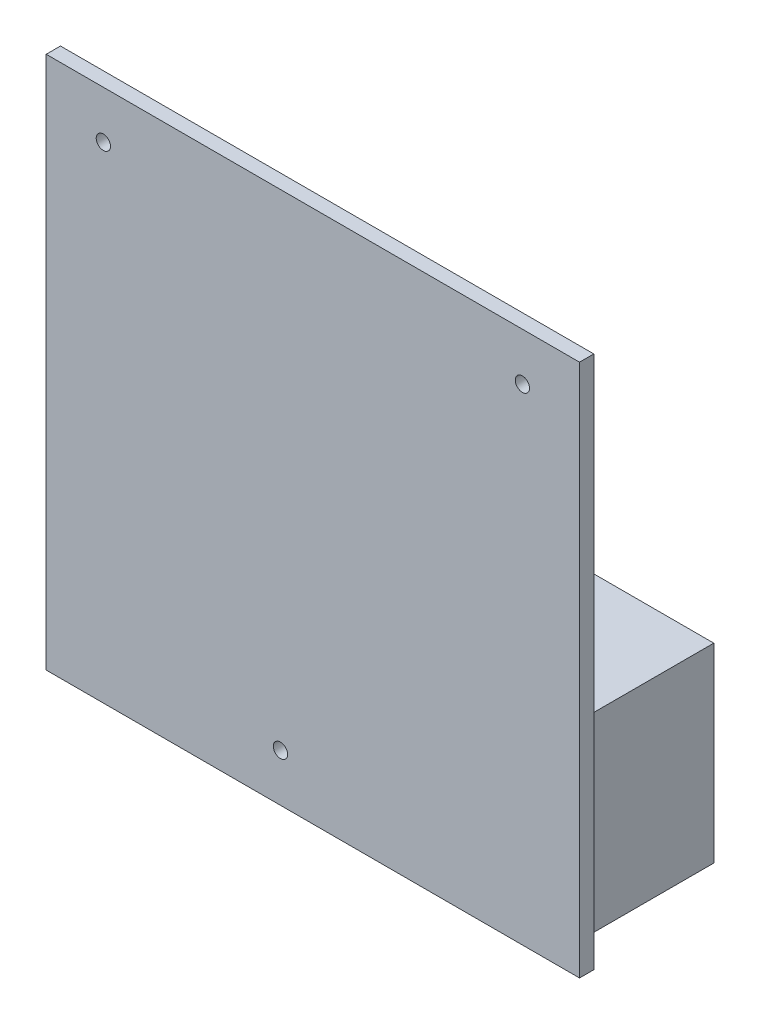
ISO-10303-21;
HEADER;
FILE_DESCRIPTION(('STEP AP214'),'2;1');
FILE_NAME('part.step','',(''),(''),'','','');
FILE_SCHEMA(('AUTOMOTIVE_DESIGN { 1 0 10303 214 1 1 1 1 }'));
ENDSEC;
DATA;
#1=APPLICATION_CONTEXT('core data for automotive mechanical design processes');
#2=APPLICATION_PROTOCOL_DEFINITION('international standard','automotive_design',2000,#1);
#3=PRODUCT_CONTEXT('',#1,'mechanical');
#4=PRODUCT('Part','Part','',(#3));
#5=PRODUCT_RELATED_PRODUCT_CATEGORY('part','',(#4));
#6=PRODUCT_DEFINITION_FORMATION('','',#4);
#7=PRODUCT_DEFINITION_CONTEXT('part definition',#1,'design');
#8=PRODUCT_DEFINITION('design','',#6,#7);
#9=PRODUCT_DEFINITION_SHAPE('','',#8);
#10=(LENGTH_UNIT() NAMED_UNIT(*) SI_UNIT(.MILLI.,.METRE.));
#11=(NAMED_UNIT(*) PLANE_ANGLE_UNIT() SI_UNIT($,.RADIAN.));
#12=(NAMED_UNIT(*) SI_UNIT($,.STERADIAN.) SOLID_ANGLE_UNIT());
#13=UNCERTAINTY_MEASURE_WITH_UNIT(LENGTH_MEASURE(1.E-05),#10,'distance_accuracy_value','');
#14=(GEOMETRIC_REPRESENTATION_CONTEXT(3) GLOBAL_UNCERTAINTY_ASSIGNED_CONTEXT((#13)) GLOBAL_UNIT_ASSIGNED_CONTEXT((#10,
#11,#12)) REPRESENTATION_CONTEXT('',''));
#15=CARTESIAN_POINT('',(0.,0.,0.));
#16=DIRECTION('',(0.,0.,1.));
#17=DIRECTION('',(1.,0.,0.));
#18=AXIS2_PLACEMENT_3D('',#15,#16,#17);
#19=CARTESIAN_POINT('',(-56.,-56.,3.));
#20=DIRECTION('',(0.,1.,0.));
#21=DIRECTION('',(0.,0.,1.));
#22=AXIS2_PLACEMENT_3D('',#19,#20,#21);
#23=PLANE('',#22);
#24=DIRECTION('',(1.,0.,0.));
#25=VECTOR('',#24,1.);
#26=CARTESIAN_POINT('',(-94.,-56.,0.));
#27=LINE('',#26,#25);
#28=CARTESIAN_POINT('',(-56.,-56.,0.));
#29=VERTEX_POINT('',#28);
#30=CARTESIAN_POINT('',(56.,-56.,0.));
#31=VERTEX_POINT('',#30);
#32=EDGE_CURVE('E155',#29,#31,#27,.T.);
#33=ORIENTED_EDGE('',*,*,#32,.F.);
#34=DIRECTION('',(0.,0.,-1.));
#35=VECTOR('',#34,1.);
#36=CARTESIAN_POINT('',(-56.,-56.,3.));
#37=LINE('',#36,#35);
#38=CARTESIAN_POINT('',(-56.,-56.,-3.));
#39=VERTEX_POINT('',#38);
#40=EDGE_CURVE('E173',#29,#39,#37,.T.);
#41=ORIENTED_EDGE('',*,*,#40,.T.);
#42=DIRECTION('',(1.,0.,0.));
#43=VECTOR('',#42,1.);
#44=CARTESIAN_POINT('',(-56.,-56.,-3.));
#45=LINE('',#44,#43);
#46=CARTESIAN_POINT('',(-0.802999999999998,-56.,-3.));
#47=VERTEX_POINT('',#46);
#48=EDGE_CURVE('E199',#39,#47,#45,.T.);
#49=ORIENTED_EDGE('',*,*,#48,.T.);
#50=DIRECTION('',(0.,0.,1.));
#51=VECTOR('',#50,1.);
#52=CARTESIAN_POINT('',(-0.802999999999998,-56.,-35.));
#53=LINE('',#52,#51);
#54=CARTESIAN_POINT('',(-0.802999999999998,-56.,-35.));
#55=VERTEX_POINT('',#54);
#56=EDGE_CURVE('E209',#55,#47,#53,.T.);
#57=ORIENTED_EDGE('',*,*,#56,.F.);
#58=DIRECTION('',(1.,0.,0.));
#59=VECTOR('',#58,1.);
#60=CARTESIAN_POINT('',(0.,-56.,-35.));
#61=LINE('',#60,#59);
#62=CARTESIAN_POINT('',(49.197,-56.,-35.));
#63=VERTEX_POINT('',#62);
#64=EDGE_CURVE('E211',#55,#63,#61,.T.);
#65=ORIENTED_EDGE('',*,*,#64,.T.);
#66=DIRECTION('',(0.,0.,1.));
#67=VECTOR('',#66,1.);
#68=CARTESIAN_POINT('',(49.197,-56.,-35.));
#69=LINE('',#68,#67);
#70=CARTESIAN_POINT('',(49.197,-56.,-3.));
#71=VERTEX_POINT('',#70);
#72=EDGE_CURVE('E207',#63,#71,#69,.T.);
#73=ORIENTED_EDGE('',*,*,#72,.T.);
#74=CARTESIAN_POINT('',(56.,-56.,-3.));
#75=VERTEX_POINT('',#74);
#76=EDGE_CURVE('E171',#71,#75,#45,.T.);
#77=ORIENTED_EDGE('',*,*,#76,.T.);
#78=DIRECTION('',(0.,0.,-1.));
#79=VECTOR('',#78,1.);
#80=CARTESIAN_POINT('',(56.,-56.,3.));
#81=LINE('',#80,#79);
#82=EDGE_CURVE('E167',#31,#75,#81,.T.);
#83=ORIENTED_EDGE('',*,*,#82,.F.);
#84=EDGE_LOOP('',(#33,#41,#49,#57,#65,#73,#77,#83));
#85=FACE_BOUND('',#84,.T.);
#86=ADVANCED_FACE('F38',(#85),#23,.F.);
#87=CARTESIAN_POINT('',(56.,-56.,3.));
#88=DIRECTION('',(-1.,0.,0.));
#89=DIRECTION('',(0.,0.,1.));
#90=AXIS2_PLACEMENT_3D('',#87,#88,#89);
#91=PLANE('',#90);
#92=DIRECTION('',(0.,-1.,0.));
#93=VECTOR('',#92,1.);
#94=CARTESIAN_POINT('',(56.,0.,0.));
#95=LINE('',#94,#93);
#96=CARTESIAN_POINT('',(56.,56.,0.));
#97=VERTEX_POINT('',#96);
#98=EDGE_CURVE('E158',#97,#31,#95,.T.);
#99=ORIENTED_EDGE('',*,*,#98,.T.);
#100=ORIENTED_EDGE('',*,*,#82,.T.);
#101=DIRECTION('',(0.,1.,0.));
#102=VECTOR('',#101,1.);
#103=CARTESIAN_POINT('',(56.,-56.,-3.));
#104=LINE('',#103,#102);
#105=CARTESIAN_POINT('',(56.,56.,-3.));
#106=VERTEX_POINT('',#105);
#107=EDGE_CURVE('E188',#75,#106,#104,.T.);
#108=ORIENTED_EDGE('',*,*,#107,.T.);
#109=DIRECTION('',(0.,0.,-1.));
#110=VECTOR('',#109,1.);
#111=CARTESIAN_POINT('',(56.,56.,3.));
#112=LINE('',#111,#110);
#113=EDGE_CURVE('E47',#97,#106,#112,.T.);
#114=ORIENTED_EDGE('',*,*,#113,.F.);
#115=EDGE_LOOP('',(#99,#100,#108,#114));
#116=FACE_BOUND('',#115,.T.);
#117=ADVANCED_FACE('F40',(#116),#91,.F.);
#118=CARTESIAN_POINT('',(-56.,56.,3.));
#119=DIRECTION('',(0.,-1.,0.));
#120=DIRECTION('',(0.,0.,-1.));
#121=AXIS2_PLACEMENT_3D('',#118,#119,#120);
#122=PLANE('',#121);
#123=DIRECTION('',(1.,0.,0.));
#124=VECTOR('',#123,1.);
#125=CARTESIAN_POINT('',(-94.,56.,0.));
#126=LINE('',#125,#124);
#127=CARTESIAN_POINT('',(-56.,56.,0.));
#128=VERTEX_POINT('',#127);
#129=EDGE_CURVE('E54',#128,#97,#126,.T.);
#130=ORIENTED_EDGE('',*,*,#129,.T.);
#131=ORIENTED_EDGE('',*,*,#113,.T.);
#132=DIRECTION('',(-1.,0.,0.));
#133=VECTOR('',#132,1.);
#134=CARTESIAN_POINT('',(-56.,56.,-3.));
#135=LINE('',#134,#133);
#136=CARTESIAN_POINT('',(-56.,56.,-3.));
#137=VERTEX_POINT('',#136);
#138=EDGE_CURVE('E174',#106,#137,#135,.T.);
#139=ORIENTED_EDGE('',*,*,#138,.T.);
#140=DIRECTION('',(0.,0.,-1.));
#141=VECTOR('',#140,1.);
#142=CARTESIAN_POINT('',(-56.,56.,3.));
#143=LINE('',#142,#141);
#144=EDGE_CURVE('E176',#128,#137,#143,.T.);
#145=ORIENTED_EDGE('',*,*,#144,.F.);
#146=EDGE_LOOP('',(#130,#131,#139,#145));
#147=FACE_BOUND('',#146,.T.);
#148=ADVANCED_FACE('F185',(#147),#122,.F.);
#149=CARTESIAN_POINT('',(-56.,-56.,3.));
#150=DIRECTION('',(1.,0.,0.));
#151=DIRECTION('',(0.,0.,-1.));
#152=AXIS2_PLACEMENT_3D('',#149,#150,#151);
#153=PLANE('',#152);
#154=DIRECTION('',(0.,-1.,0.));
#155=VECTOR('',#154,1.);
#156=CARTESIAN_POINT('',(-56.,-56.,0.));
#157=LINE('',#156,#155);
#158=EDGE_CURVE('E159',#128,#29,#157,.T.);
#159=ORIENTED_EDGE('',*,*,#158,.F.);
#160=ORIENTED_EDGE('',*,*,#144,.T.);
#161=DIRECTION('',(0.,-1.,0.));
#162=VECTOR('',#161,1.);
#163=CARTESIAN_POINT('',(-56.,-56.,-3.));
#164=LINE('',#163,#162);
#165=EDGE_CURVE('E179',#137,#39,#164,.T.);
#166=ORIENTED_EDGE('',*,*,#165,.T.);
#167=ORIENTED_EDGE('',*,*,#40,.F.);
#168=EDGE_LOOP('',(#159,#160,#166,#167));
#169=FACE_BOUND('',#168,.T.);
#170=ADVANCED_FACE('F339',(#169),#153,.F.);
#171=CARTESIAN_POINT('',(-6.803,-46.,-43.));
#172=DIRECTION('',(0.,0.,1.));
#173=DIRECTION('',(1.,0.,0.));
#174=AXIS2_PLACEMENT_3D('',#171,#172,#173);
#175=CYLINDRICAL_SURFACE('',#174,1.5);
#176=CARTESIAN_POINT('',(-6.803,-46.,-3.));
#177=DIRECTION('',(0.,0.,1.));
#178=DIRECTION('',(1.,0.,0.));
#179=AXIS2_PLACEMENT_3D('',#176,#177,#178);
#180=CIRCLE('',#179,1.5);
#181=CARTESIAN_POINT('',(-5.303,-46.,-3.));
#182=VERTEX_POINT('',#181);
#183=EDGE_CURVE('E295',#182,#182,#180,.T.);
#184=ORIENTED_EDGE('',*,*,#183,.F.);
#185=EDGE_LOOP('',(#184));
#186=FACE_BOUND('',#185,.T.);
#187=CARTESIAN_POINT('',(-6.803,-46.,0.));
#188=DIRECTION('',(0.,0.,1.));
#189=DIRECTION('',(1.,0.,0.));
#190=AXIS2_PLACEMENT_3D('',#187,#188,#189);
#191=CIRCLE('',#190,1.5);
#192=CARTESIAN_POINT('',(-5.303,-46.,0.));
#193=VERTEX_POINT('',#192);
#194=EDGE_CURVE('E304',#193,#193,#191,.F.);
#195=ORIENTED_EDGE('',*,*,#194,.F.);
#196=EDGE_LOOP('',(#195));
#197=FACE_BOUND('',#196,.T.);
#198=ADVANCED_FACE('F327',(#186,#197),#175,.F.);
#199=CARTESIAN_POINT('',(44.,46.,-43.));
#200=DIRECTION('',(0.,0.,1.));
#201=DIRECTION('',(1.,0.,0.));
#202=AXIS2_PLACEMENT_3D('',#199,#200,#201);
#203=CYLINDRICAL_SURFACE('',#202,1.5);
#204=CARTESIAN_POINT('',(44.,46.,-3.));
#205=DIRECTION('',(0.,0.,1.));
#206=DIRECTION('',(1.,0.,0.));
#207=AXIS2_PLACEMENT_3D('',#204,#205,#206);
#208=CIRCLE('',#207,1.5);
#209=CARTESIAN_POINT('',(45.5,46.,-3.));
#210=VERTEX_POINT('',#209);
#211=EDGE_CURVE('E298',#210,#210,#208,.T.);
#212=ORIENTED_EDGE('',*,*,#211,.F.);
#213=EDGE_LOOP('',(#212));
#214=FACE_BOUND('',#213,.T.);
#215=CARTESIAN_POINT('',(44.,46.,0.));
#216=DIRECTION('',(0.,0.,1.));
#217=DIRECTION('',(1.,0.,0.));
#218=AXIS2_PLACEMENT_3D('',#215,#216,#217);
#219=CIRCLE('',#218,1.5);
#220=CARTESIAN_POINT('',(45.5,46.,0.));
#221=VERTEX_POINT('',#220);
#222=EDGE_CURVE('E307',#221,#221,#219,.F.);
#223=ORIENTED_EDGE('',*,*,#222,.F.);
#224=EDGE_LOOP('',(#223));
#225=FACE_BOUND('',#224,.T.);
#226=ADVANCED_FACE('F317',(#214,#225),#203,.F.);
#227=CARTESIAN_POINT('',(-44.,46.,-43.));
#228=DIRECTION('',(0.,0.,1.));
#229=DIRECTION('',(1.,0.,0.));
#230=AXIS2_PLACEMENT_3D('',#227,#228,#229);
#231=CYLINDRICAL_SURFACE('',#230,1.5);
#232=CARTESIAN_POINT('',(-44.,46.,-3.));
#233=DIRECTION('',(0.,0.,1.));
#234=DIRECTION('',(1.,0.,0.));
#235=AXIS2_PLACEMENT_3D('',#232,#233,#234);
#236=CIRCLE('',#235,1.5);
#237=CARTESIAN_POINT('',(-42.5,46.,-3.));
#238=VERTEX_POINT('',#237);
#239=EDGE_CURVE('E294',#238,#238,#236,.T.);
#240=ORIENTED_EDGE('',*,*,#239,.F.);
#241=EDGE_LOOP('',(#240));
#242=FACE_BOUND('',#241,.T.);
#243=CARTESIAN_POINT('',(-44.,46.,0.));
#244=DIRECTION('',(0.,0.,1.));
#245=DIRECTION('',(1.,0.,0.));
#246=AXIS2_PLACEMENT_3D('',#243,#244,#245);
#247=CIRCLE('',#246,1.5);
#248=CARTESIAN_POINT('',(-42.5,46.,0.));
#249=VERTEX_POINT('',#248);
#250=EDGE_CURVE('E42',#249,#249,#247,.F.);
#251=ORIENTED_EDGE('',*,*,#250,.F.);
#252=EDGE_LOOP('',(#251));
#253=FACE_BOUND('',#252,.T.);
#254=ADVANCED_FACE('F314',(#242,#253),#231,.F.);
#255=CARTESIAN_POINT('',(-52.,-17.5,-21.));
#256=DIRECTION('',(1.,0.,0.));
#257=DIRECTION('',(0.,0.,-1.));
#258=AXIS2_PLACEMENT_3D('',#255,#256,#257);
#259=PLANE('',#258);
#260=DIRECTION('',(0.,-1.,0.));
#261=VECTOR('',#260,1.);
#262=CARTESIAN_POINT('',(-52.,28.5,-11.));
#263=LINE('',#262,#261);
#264=CARTESIAN_POINT('',(-52.,-15.,-11.));
#265=VERTEX_POINT('',#264);
#266=CARTESIAN_POINT('',(-52.,-17.5,-11.));
#267=VERTEX_POINT('',#266);
#268=EDGE_CURVE('E288',#265,#267,#263,.T.);
#269=ORIENTED_EDGE('',*,*,#268,.T.);
#270=DIRECTION('',(0.,0.,1.));
#271=VECTOR('',#270,1.);
#272=CARTESIAN_POINT('',(-52.,-17.5,-21.));
#273=LINE('',#272,#271);
#274=CARTESIAN_POINT('',(-52.,-17.5,-3.));
#275=VERTEX_POINT('',#274);
#276=EDGE_CURVE('E233',#267,#275,#273,.T.);
#277=ORIENTED_EDGE('',*,*,#276,.T.);
#278=DIRECTION('',(0.,1.,0.));
#279=VECTOR('',#278,1.);
#280=CARTESIAN_POINT('',(-52.,-17.5,-3.));
#281=LINE('',#280,#279);
#282=CARTESIAN_POINT('',(-52.,17.5,-3.));
#283=VERTEX_POINT('',#282);
#284=EDGE_CURVE('E247',#275,#283,#281,.T.);
#285=ORIENTED_EDGE('',*,*,#284,.T.);
#286=DIRECTION('',(0.,0.,1.));
#287=VECTOR('',#286,1.);
#288=CARTESIAN_POINT('',(-52.,17.5,-21.));
#289=LINE('',#288,#287);
#290=CARTESIAN_POINT('',(-52.,17.5,-11.));
#291=VERTEX_POINT('',#290);
#292=EDGE_CURVE('E231',#291,#283,#289,.T.);
#293=ORIENTED_EDGE('',*,*,#292,.F.);
#294=CARTESIAN_POINT('',(-52.,15.,-11.));
#295=VERTEX_POINT('',#294);
#296=EDGE_CURVE('E285',#291,#295,#263,.T.);
#297=ORIENTED_EDGE('',*,*,#296,.T.);
#298=DIRECTION('',(0.,0.,-1.));
#299=VECTOR('',#298,1.);
#300=CARTESIAN_POINT('',(-52.,15.,-5.));
#301=LINE('',#300,#299);
#302=CARTESIAN_POINT('',(-52.,15.,-5.));
#303=VERTEX_POINT('',#302);
#304=EDGE_CURVE('E259',#303,#295,#301,.T.);
#305=ORIENTED_EDGE('',*,*,#304,.F.);
#306=DIRECTION('',(0.,-1.,0.));
#307=VECTOR('',#306,1.);
#308=CARTESIAN_POINT('',(-52.,-15.,-5.));
#309=LINE('',#308,#307);
#310=CARTESIAN_POINT('',(-52.,-15.,-5.));
#311=VERTEX_POINT('',#310);
#312=EDGE_CURVE('E276',#303,#311,#309,.T.);
#313=ORIENTED_EDGE('',*,*,#312,.T.);
#314=DIRECTION('',(0.,0.,-1.));
#315=VECTOR('',#314,1.);
#316=CARTESIAN_POINT('',(-52.,-15.,-5.));
#317=LINE('',#316,#315);
#318=EDGE_CURVE('E253',#311,#265,#317,.T.);
#319=ORIENTED_EDGE('',*,*,#318,.T.);
#320=EDGE_LOOP('',(#269,#277,#285,#293,#297,#305,#313,#319));
#321=FACE_BOUND('',#320,.T.);
#322=ADVANCED_FACE('F316',(#321),#259,.F.);
#323=CARTESIAN_POINT('',(0.,0.,-21.));
#324=DIRECTION('',(0.,0.,1.));
#325=DIRECTION('',(-1.,0.,0.));
#326=AXIS2_PLACEMENT_3D('',#323,#324,#325);
#327=PLANE('',#326);
#328=DIRECTION('',(0.,-1.,0.));
#329=VECTOR('',#328,1.);
#330=CARTESIAN_POINT('',(-34.0002977524627,28.5,-21.));
#331=LINE('',#330,#329);
#332=CARTESIAN_POINT('',(-34.0002977524627,17.5,-21.));
#333=VERTEX_POINT('',#332);
#334=CARTESIAN_POINT('',(-34.0002977524627,-17.5,-21.));
#335=VERTEX_POINT('',#334);
#336=EDGE_CURVE('E286',#333,#335,#331,.T.);
#337=ORIENTED_EDGE('',*,*,#336,.F.);
#338=DIRECTION('',(1.,0.,0.));
#339=VECTOR('',#338,1.);
#340=CARTESIAN_POINT('',(-52.,17.5,-21.));
#341=LINE('',#340,#339);
#342=CARTESIAN_POINT('',(-32.,17.5,-21.));
#343=VERTEX_POINT('',#342);
#344=EDGE_CURVE('E244',#333,#343,#341,.T.);
#345=ORIENTED_EDGE('',*,*,#344,.T.);
#346=DIRECTION('',(0.,-1.,0.));
#347=VECTOR('',#346,1.);
#348=CARTESIAN_POINT('',(-32.,17.5,-21.));
#349=LINE('',#348,#347);
#350=CARTESIAN_POINT('',(-32.,-17.5,-21.));
#351=VERTEX_POINT('',#350);
#352=EDGE_CURVE('E234',#343,#351,#349,.T.);
#353=ORIENTED_EDGE('',*,*,#352,.T.);
#354=DIRECTION('',(1.,0.,0.));
#355=VECTOR('',#354,1.);
#356=CARTESIAN_POINT('',(-52.,-17.5,-21.));
#357=LINE('',#356,#355);
#358=EDGE_CURVE('E256',#335,#351,#357,.T.);
#359=ORIENTED_EDGE('',*,*,#358,.F.);
#360=EDGE_LOOP('',(#337,#345,#353,#359));
#361=FACE_BOUND('',#360,.T.);
#362=ADVANCED_FACE('F324',(#361),#327,.F.);
#363=CARTESIAN_POINT('',(-52.,17.5,-21.));
#364=DIRECTION('',(0.,-1.,0.));
#365=DIRECTION('',(1.,0.,0.));
#366=AXIS2_PLACEMENT_3D('',#363,#364,#365);
#367=PLANE('',#366);
#368=DIRECTION('',(0.874153865646997,0.,-0.485649069982031));
#369=VECTOR('',#368,1.);
#370=CARTESIAN_POINT('',(-47.7546798812734,17.5,-13.3585501917441));
#371=LINE('',#370,#369);
#372=EDGE_CURVE('E279',#291,#333,#371,.T.);
#373=ORIENTED_EDGE('',*,*,#372,.F.);
#374=ORIENTED_EDGE('',*,*,#292,.T.);
#375=DIRECTION('',(1.,0.,0.));
#376=VECTOR('',#375,1.);
#377=CARTESIAN_POINT('',(-52.,17.5,-3.));
#378=LINE('',#377,#376);
#379=CARTESIAN_POINT('',(-32.,17.5,-3.));
#380=VERTEX_POINT('',#379);
#381=EDGE_CURVE('E250',#283,#380,#378,.T.);
#382=ORIENTED_EDGE('',*,*,#381,.T.);
#383=DIRECTION('',(0.,0.,1.));
#384=VECTOR('',#383,1.);
#385=CARTESIAN_POINT('',(-32.,17.5,-21.));
#386=LINE('',#385,#384);
#387=EDGE_CURVE('E221',#343,#380,#386,.T.);
#388=ORIENTED_EDGE('',*,*,#387,.F.);
#389=ORIENTED_EDGE('',*,*,#344,.F.);
#390=EDGE_LOOP('',(#373,#374,#382,#388,#389));
#391=FACE_BOUND('',#390,.T.);
#392=ADVANCED_FACE('F471',(#391),#367,.F.);
#393=CARTESIAN_POINT('',(-52.,-17.5,-21.));
#394=DIRECTION('',(0.,-1.,0.));
#395=DIRECTION('',(1.,0.,0.));
#396=AXIS2_PLACEMENT_3D('',#393,#394,#395);
#397=PLANE('',#396);
#398=ORIENTED_EDGE('',*,*,#276,.F.);
#399=DIRECTION('',(0.874153865646997,0.,-0.485649069982031));
#400=VECTOR('',#399,1.);
#401=CARTESIAN_POINT('',(-16.9343131276687,-17.5,-30.4812594064599));
#402=LINE('',#401,#400);
#403=EDGE_CURVE('E289',#267,#335,#402,.T.);
#404=ORIENTED_EDGE('',*,*,#403,.T.);
#405=ORIENTED_EDGE('',*,*,#358,.T.);
#406=DIRECTION('',(0.,0.,1.));
#407=VECTOR('',#406,1.);
#408=CARTESIAN_POINT('',(-32.,-17.5,-21.));
#409=LINE('',#408,#407);
#410=CARTESIAN_POINT('',(-32.,-17.5,-3.));
#411=VERTEX_POINT('',#410);
#412=EDGE_CURVE('E236',#351,#411,#409,.T.);
#413=ORIENTED_EDGE('',*,*,#412,.T.);
#414=DIRECTION('',(1.,0.,0.));
#415=VECTOR('',#414,1.);
#416=CARTESIAN_POINT('',(-52.,-17.5,-3.));
#417=LINE('',#416,#415);
#418=EDGE_CURVE('E245',#275,#411,#417,.T.);
#419=ORIENTED_EDGE('',*,*,#418,.F.);
#420=EDGE_LOOP('',(#398,#404,#405,#413,#419));
#421=FACE_BOUND('',#420,.T.);
#422=ADVANCED_FACE('F463',(#421),#397,.T.);
#423=CARTESIAN_POINT('',(-34.5,-15.,-5.));
#424=DIRECTION('',(0.,1.,0.));
#425=DIRECTION('',(-1.,0.,0.));
#426=AXIS2_PLACEMENT_3D('',#423,#424,#425);
#427=PLANE('',#426);
#428=DIRECTION('',(0.,0.,-1.));
#429=VECTOR('',#428,1.);
#430=CARTESIAN_POINT('',(-34.5,-15.,-5.));
#431=LINE('',#430,#429);
#432=CARTESIAN_POINT('',(-34.5,-15.,-5.));
#433=VERTEX_POINT('',#432);
#434=CARTESIAN_POINT('',(-34.5,-15.,-20.722383047972));
#435=VERTEX_POINT('',#434);
#436=EDGE_CURVE('E266',#433,#435,#431,.T.);
#437=ORIENTED_EDGE('',*,*,#436,.T.);
#438=DIRECTION('',(-0.874153865646997,0.,0.485649069982031));
#439=VECTOR('',#438,1.);
#440=CARTESIAN_POINT('',(-41.1746549067882,-15.,-17.0141800927251));
#441=LINE('',#440,#439);
#442=EDGE_CURVE('E281',#435,#265,#441,.T.);
#443=ORIENTED_EDGE('',*,*,#442,.T.);
#444=ORIENTED_EDGE('',*,*,#318,.F.);
#445=DIRECTION('',(1.,0.,0.));
#446=VECTOR('',#445,1.);
#447=CARTESIAN_POINT('',(-34.5,-15.,-5.));
#448=LINE('',#447,#446);
#449=EDGE_CURVE('E263',#311,#433,#448,.T.);
#450=ORIENTED_EDGE('',*,*,#449,.T.);
#451=EDGE_LOOP('',(#437,#443,#444,#450));
#452=FACE_BOUND('',#451,.T.);
#453=ADVANCED_FACE('F455',(#452),#427,.T.);
#454=CARTESIAN_POINT('',(-34.5,15.,-5.));
#455=DIRECTION('',(-1.,0.,0.));
#456=DIRECTION('',(0.,-1.,0.));
#457=AXIS2_PLACEMENT_3D('',#454,#455,#456);
#458=PLANE('',#457);
#459=DIRECTION('',(0.,0.,-1.));
#460=VECTOR('',#459,1.);
#461=CARTESIAN_POINT('',(-34.5,15.,-5.));
#462=LINE('',#461,#460);
#463=CARTESIAN_POINT('',(-34.5,15.,-5.));
#464=VERTEX_POINT('',#463);
#465=CARTESIAN_POINT('',(-34.5,15.,-20.722383047972));
#466=VERTEX_POINT('',#465);
#467=EDGE_CURVE('E262',#464,#466,#462,.T.);
#468=ORIENTED_EDGE('',*,*,#467,.T.);
#469=DIRECTION('',(0.,-1.,0.));
#470=VECTOR('',#469,1.);
#471=CARTESIAN_POINT('',(-34.5,15.,-20.722383047972));
#472=LINE('',#471,#470);
#473=EDGE_CURVE('E62',#466,#435,#472,.T.);
#474=ORIENTED_EDGE('',*,*,#473,.T.);
#475=ORIENTED_EDGE('',*,*,#436,.F.);
#476=DIRECTION('',(0.,1.,0.));
#477=VECTOR('',#476,1.);
#478=CARTESIAN_POINT('',(-34.5,15.,-5.));
#479=LINE('',#478,#477);
#480=EDGE_CURVE('E272',#433,#464,#479,.T.);
#481=ORIENTED_EDGE('',*,*,#480,.T.);
#482=EDGE_LOOP('',(#468,#474,#475,#481));
#483=FACE_BOUND('',#482,.T.);
#484=ADVANCED_FACE('F447',(#483),#458,.T.);
#485=CARTESIAN_POINT('',(-52.,15.,-5.));
#486=DIRECTION('',(0.,-1.,0.));
#487=DIRECTION('',(1.,0.,0.));
#488=AXIS2_PLACEMENT_3D('',#485,#486,#487);
#489=PLANE('',#488);
#490=ORIENTED_EDGE('',*,*,#304,.T.);
#491=DIRECTION('',(0.874153865646997,0.,-0.485649069982031));
#492=VECTOR('',#491,1.);
#493=CARTESIAN_POINT('',(-54.547192071236,15.,-9.58486988495353));
#494=LINE('',#493,#492);
#495=EDGE_CURVE('E11',#295,#466,#494,.T.);
#496=ORIENTED_EDGE('',*,*,#495,.T.);
#497=ORIENTED_EDGE('',*,*,#467,.F.);
#498=DIRECTION('',(-1.,0.,0.));
#499=VECTOR('',#498,1.);
#500=CARTESIAN_POINT('',(-52.,15.,-5.));
#501=LINE('',#500,#499);
#502=EDGE_CURVE('E274',#464,#303,#501,.T.);
#503=ORIENTED_EDGE('',*,*,#502,.T.);
#504=EDGE_LOOP('',(#490,#496,#497,#503));
#505=FACE_BOUND('',#504,.T.);
#506=ADVANCED_FACE('F440',(#505),#489,.T.);
#507=CARTESIAN_POINT('',(0.,0.,-3.));
#508=DIRECTION('',(0.,0.,1.));
#509=DIRECTION('',(-1.,0.,0.));
#510=AXIS2_PLACEMENT_3D('',#507,#508,#509);
#511=PLANE('',#510);
#512=ORIENTED_EDGE('',*,*,#239,.T.);
#513=EDGE_LOOP('',(#512));
#514=FACE_BOUND('',#513,.T.);
#515=ORIENTED_EDGE('',*,*,#211,.T.);
#516=EDGE_LOOP('',(#515));
#517=FACE_BOUND('',#516,.T.);
#518=ORIENTED_EDGE('',*,*,#183,.T.);
#519=EDGE_LOOP('',(#518));
#520=FACE_BOUND('',#519,.T.);
#521=DIRECTION('',(0.,1.,0.));
#522=VECTOR('',#521,1.);
#523=CARTESIAN_POINT('',(-0.802999999999998,0.,-3.));
#524=LINE('',#523,#522);
#525=CARTESIAN_POINT('',(-0.802999999999998,-16.,-3.));
#526=VERTEX_POINT('',#525);
#527=EDGE_CURVE('E219',#47,#526,#524,.T.);
#528=ORIENTED_EDGE('',*,*,#527,.F.);
#529=ORIENTED_EDGE('',*,*,#48,.F.);
#530=ORIENTED_EDGE('',*,*,#165,.F.);
#531=ORIENTED_EDGE('',*,*,#138,.F.);
#532=ORIENTED_EDGE('',*,*,#107,.F.);
#533=ORIENTED_EDGE('',*,*,#76,.F.);
#534=DIRECTION('',(0.,1.,0.));
#535=VECTOR('',#534,1.);
#536=CARTESIAN_POINT('',(49.197,0.,-3.));
#537=LINE('',#536,#535);
#538=CARTESIAN_POINT('',(49.197,-16.,-3.));
#539=VERTEX_POINT('',#538);
#540=EDGE_CURVE('E212',#71,#539,#537,.T.);
#541=ORIENTED_EDGE('',*,*,#540,.T.);
#542=DIRECTION('',(-1.,0.,0.));
#543=VECTOR('',#542,1.);
#544=CARTESIAN_POINT('',(0.,-16.,-3.));
#545=LINE('',#544,#543);
#546=EDGE_CURVE('E216',#539,#526,#545,.T.);
#547=ORIENTED_EDGE('',*,*,#546,.T.);
#548=EDGE_LOOP('',(#528,#529,#530,#531,#532,#533,#541,#547));
#549=FACE_BOUND('',#548,.T.);
#550=ORIENTED_EDGE('',*,*,#381,.F.);
#551=ORIENTED_EDGE('',*,*,#284,.F.);
#552=ORIENTED_EDGE('',*,*,#418,.T.);
#553=DIRECTION('',(0.,-1.,0.));
#554=VECTOR('',#553,1.);
#555=CARTESIAN_POINT('',(-32.,17.5,-3.));
#556=LINE('',#555,#554);
#557=EDGE_CURVE('E241',#380,#411,#556,.T.);
#558=ORIENTED_EDGE('',*,*,#557,.F.);
#559=EDGE_LOOP('',(#550,#551,#552,#558));
#560=FACE_BOUND('',#559,.T.);
#561=ADVANCED_FACE('F194',(#514,#517,#520,#549,#560),#511,.F.);
#562=CARTESIAN_POINT('',(-0.802999999999998,0.,-35.));
#563=DIRECTION('',(1.,0.,0.));
#564=DIRECTION('',(0.,0.,-1.));
#565=AXIS2_PLACEMENT_3D('',#562,#563,#564);
#566=PLANE('',#565);
#567=ORIENTED_EDGE('',*,*,#527,.T.);
#568=DIRECTION('',(0.,0.,1.));
#569=VECTOR('',#568,1.);
#570=CARTESIAN_POINT('',(-0.802999999999998,-16.,-35.));
#571=LINE('',#570,#569);
#572=CARTESIAN_POINT('',(-0.802999999999998,-16.,-35.));
#573=VERTEX_POINT('',#572);
#574=EDGE_CURVE('E190',#573,#526,#571,.T.);
#575=ORIENTED_EDGE('',*,*,#574,.F.);
#576=DIRECTION('',(0.,1.,0.));
#577=VECTOR('',#576,1.);
#578=CARTESIAN_POINT('',(-0.802999999999998,0.,-35.));
#579=LINE('',#578,#577);
#580=EDGE_CURVE('E215',#55,#573,#579,.T.);
#581=ORIENTED_EDGE('',*,*,#580,.F.);
#582=ORIENTED_EDGE('',*,*,#56,.T.);
#583=EDGE_LOOP('',(#567,#575,#581,#582));
#584=FACE_BOUND('',#583,.T.);
#585=ADVANCED_FACE('F425',(#584),#566,.F.);
#586=CARTESIAN_POINT('',(0.,-16.,-35.));
#587=DIRECTION('',(0.,1.,0.));
#588=DIRECTION('',(-1.,0.,0.));
#589=AXIS2_PLACEMENT_3D('',#586,#587,#588);
#590=PLANE('',#589);
#591=ORIENTED_EDGE('',*,*,#546,.F.);
#592=DIRECTION('',(0.,0.,1.));
#593=VECTOR('',#592,1.);
#594=CARTESIAN_POINT('',(49.197,-16.,-35.));
#595=LINE('',#594,#593);
#596=CARTESIAN_POINT('',(49.197,-16.,-35.));
#597=VERTEX_POINT('',#596);
#598=EDGE_CURVE('E205',#597,#539,#595,.T.);
#599=ORIENTED_EDGE('',*,*,#598,.F.);
#600=DIRECTION('',(-1.,0.,0.));
#601=VECTOR('',#600,1.);
#602=CARTESIAN_POINT('',(0.,-16.,-35.));
#603=LINE('',#602,#601);
#604=EDGE_CURVE('E227',#597,#573,#603,.T.);
#605=ORIENTED_EDGE('',*,*,#604,.T.);
#606=ORIENTED_EDGE('',*,*,#574,.T.);
#607=EDGE_LOOP('',(#591,#599,#605,#606));
#608=FACE_BOUND('',#607,.T.);
#609=ADVANCED_FACE('F417',(#608),#590,.T.);
#610=CARTESIAN_POINT('',(49.197,0.,-35.));
#611=DIRECTION('',(1.,0.,0.));
#612=DIRECTION('',(0.,0.,-1.));
#613=AXIS2_PLACEMENT_3D('',#610,#611,#612);
#614=PLANE('',#613);
#615=ORIENTED_EDGE('',*,*,#540,.F.);
#616=ORIENTED_EDGE('',*,*,#72,.F.);
#617=DIRECTION('',(0.,1.,0.));
#618=VECTOR('',#617,1.);
#619=CARTESIAN_POINT('',(49.197,0.,-35.));
#620=LINE('',#619,#618);
#621=EDGE_CURVE('E224',#63,#597,#620,.T.);
#622=ORIENTED_EDGE('',*,*,#621,.T.);
#623=ORIENTED_EDGE('',*,*,#598,.T.);
#624=EDGE_LOOP('',(#615,#616,#622,#623));
#625=FACE_BOUND('',#624,.T.);
#626=ADVANCED_FACE('F409',(#625),#614,.T.);
#627=CARTESIAN_POINT('',(0.,0.,-35.));
#628=DIRECTION('',(0.,0.,-1.));
#629=DIRECTION('',(1.,0.,0.));
#630=AXIS2_PLACEMENT_3D('',#627,#628,#629);
#631=PLANE('',#630);
#632=ORIENTED_EDGE('',*,*,#580,.T.);
#633=ORIENTED_EDGE('',*,*,#604,.F.);
#634=ORIENTED_EDGE('',*,*,#621,.F.);
#635=ORIENTED_EDGE('',*,*,#64,.F.);
#636=EDGE_LOOP('',(#632,#633,#634,#635));
#637=FACE_BOUND('',#636,.T.);
#638=ADVANCED_FACE('F401',(#637),#631,.T.);
#639=CARTESIAN_POINT('',(-32.,17.5,-21.));
#640=DIRECTION('',(-1.,0.,0.));
#641=DIRECTION('',(0.,-1.,0.));
#642=AXIS2_PLACEMENT_3D('',#639,#640,#641);
#643=PLANE('',#642);
#644=ORIENTED_EDGE('',*,*,#557,.T.);
#645=ORIENTED_EDGE('',*,*,#412,.F.);
#646=ORIENTED_EDGE('',*,*,#352,.F.);
#647=ORIENTED_EDGE('',*,*,#387,.T.);
#648=EDGE_LOOP('',(#644,#645,#646,#647));
#649=FACE_BOUND('',#648,.T.);
#650=ADVANCED_FACE('F393',(#649),#643,.F.);
#651=CARTESIAN_POINT('',(0.,0.,-5.));
#652=DIRECTION('',(0.,0.,1.));
#653=DIRECTION('',(-1.,0.,0.));
#654=AXIS2_PLACEMENT_3D('',#651,#652,#653);
#655=PLANE('',#654);
#656=ORIENTED_EDGE('',*,*,#312,.F.);
#657=ORIENTED_EDGE('',*,*,#502,.F.);
#658=ORIENTED_EDGE('',*,*,#480,.F.);
#659=ORIENTED_EDGE('',*,*,#449,.F.);
#660=EDGE_LOOP('',(#656,#657,#658,#659));
#661=FACE_BOUND('',#660,.T.);
#662=ADVANCED_FACE('F386',(#661),#655,.F.);
#663=CARTESIAN_POINT('',(-16.9343131276687,28.5,-30.4812594064599));
#664=DIRECTION('',(-0.485649069982031,0.,-0.874153865646997));
#665=DIRECTION('',(-0.874153865646997,0.,0.485649069982031));
#666=AXIS2_PLACEMENT_3D('',#663,#664,#665);
#667=PLANE('',#666);
#668=ORIENTED_EDGE('',*,*,#372,.T.);
#669=ORIENTED_EDGE('',*,*,#336,.T.);
#670=ORIENTED_EDGE('',*,*,#403,.F.);
#671=ORIENTED_EDGE('',*,*,#268,.F.);
#672=ORIENTED_EDGE('',*,*,#442,.F.);
#673=ORIENTED_EDGE('',*,*,#473,.F.);
#674=ORIENTED_EDGE('',*,*,#495,.F.);
#675=ORIENTED_EDGE('',*,*,#296,.F.);
#676=EDGE_LOOP('',(#668,#669,#670,#671,#672,#673,#674,#675));
#677=FACE_BOUND('',#676,.T.);
#678=ADVANCED_FACE('F375',(#677),#667,.T.);
#679=CARTESIAN_POINT('',(-94.,0.,0.));
#680=DIRECTION('',(0.,0.,1.));
#681=DIRECTION('',(1.,0.,0.));
#682=AXIS2_PLACEMENT_3D('',#679,#680,#681);
#683=PLANE('',#682);
#684=ORIENTED_EDGE('',*,*,#194,.T.);
#685=EDGE_LOOP('',(#684));
#686=FACE_BOUND('',#685,.T.);
#687=ORIENTED_EDGE('',*,*,#222,.T.);
#688=EDGE_LOOP('',(#687));
#689=FACE_BOUND('',#688,.T.);
#690=ORIENTED_EDGE('',*,*,#250,.T.);
#691=EDGE_LOOP('',(#690));
#692=FACE_BOUND('',#691,.T.);
#693=ORIENTED_EDGE('',*,*,#158,.T.);
#694=ORIENTED_EDGE('',*,*,#32,.T.);
#695=ORIENTED_EDGE('',*,*,#98,.F.);
#696=ORIENTED_EDGE('',*,*,#129,.F.);
#697=EDGE_LOOP('',(#693,#694,#695,#696));
#698=FACE_BOUND('',#697,.T.);
#699=ADVANCED_FACE('F157',(#686,#689,#692,#698),#683,.T.);
#700=CLOSED_SHELL('',(#86,#117,#148,#170,#198,#226,#254,#322,#362,#392,#422,#453,#484,#506,#561,
#585,#609,#626,#638,#650,#662,#678,#699));
#701=MANIFOLD_SOLID_BREP('B2',#700);
#702=ADVANCED_BREP_SHAPE_REPRESENTATION('',(#18,#701),#14);
#703=SHAPE_DEFINITION_REPRESENTATION(#9,#702);
ENDSEC;
END-ISO-10303-21;
